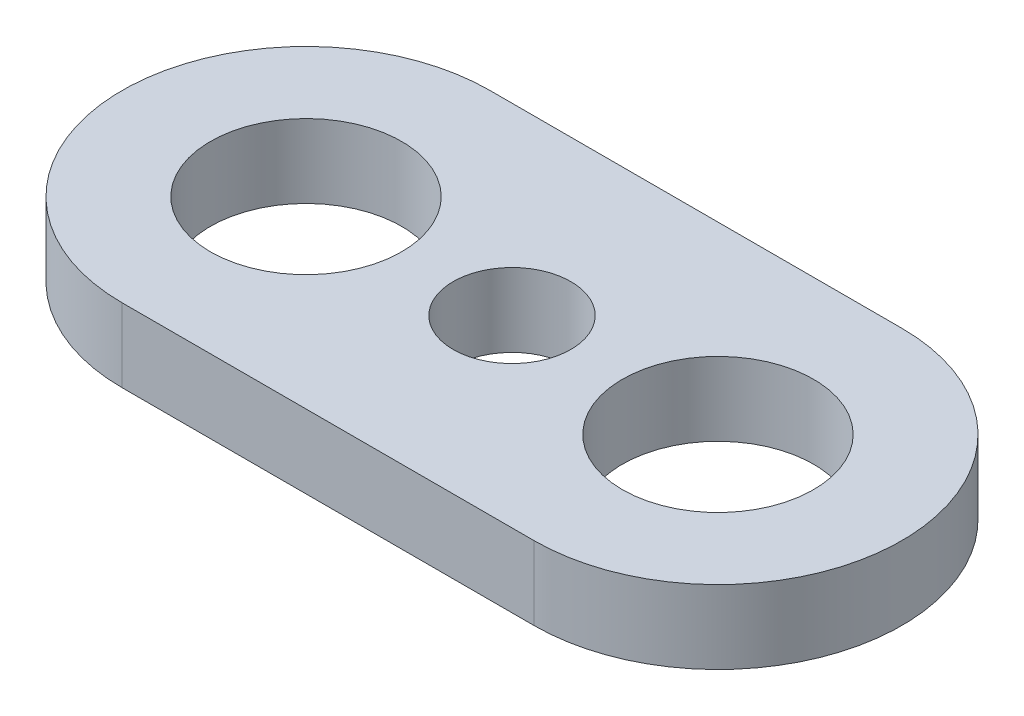
ISO-10303-21;
HEADER;
FILE_DESCRIPTION(('STEP AP214'),'2;1');
FILE_NAME('part.step','',(''),(''),'','','');
FILE_SCHEMA(('AUTOMOTIVE_DESIGN { 1 0 10303 214 1 1 1 1 }'));
ENDSEC;
DATA;
#1=APPLICATION_CONTEXT('core data for automotive mechanical design processes');
#2=APPLICATION_PROTOCOL_DEFINITION('international standard','automotive_design',2000,#1);
#3=PRODUCT_CONTEXT('',#1,'mechanical');
#4=PRODUCT('Part','Part','',(#3));
#5=PRODUCT_RELATED_PRODUCT_CATEGORY('part','',(#4));
#6=PRODUCT_DEFINITION_FORMATION('','',#4);
#7=PRODUCT_DEFINITION_CONTEXT('part definition',#1,'design');
#8=PRODUCT_DEFINITION('design','',#6,#7);
#9=PRODUCT_DEFINITION_SHAPE('','',#8);
#10=(LENGTH_UNIT() NAMED_UNIT(*) SI_UNIT(.MILLI.,.METRE.));
#11=(NAMED_UNIT(*) PLANE_ANGLE_UNIT() SI_UNIT($,.RADIAN.));
#12=(NAMED_UNIT(*) SI_UNIT($,.STERADIAN.) SOLID_ANGLE_UNIT());
#13=UNCERTAINTY_MEASURE_WITH_UNIT(LENGTH_MEASURE(1.E-05),#10,'distance_accuracy_value','');
#14=(GEOMETRIC_REPRESENTATION_CONTEXT(3) GLOBAL_UNCERTAINTY_ASSIGNED_CONTEXT((#13)) GLOBAL_UNIT_ASSIGNED_CONTEXT((#10,
#11,#12)) REPRESENTATION_CONTEXT('',''));
#15=CARTESIAN_POINT('',(0.,0.,0.));
#16=DIRECTION('',(0.,0.,1.));
#17=DIRECTION('',(1.,0.,0.));
#18=AXIS2_PLACEMENT_3D('',#15,#16,#17);
#19=CARTESIAN_POINT('',(-5.6,2.,0.));
#20=DIRECTION('',(0.,1.,0.));
#21=DIRECTION('',(0.,0.,1.));
#22=AXIS2_PLACEMENT_3D('',#19,#20,#21);
#23=PLANE('',#22);
#24=CARTESIAN_POINT('',(5.6,2.,0.));
#25=DIRECTION('',(0.,1.,0.));
#26=DIRECTION('',(0.,0.,1.));
#27=AXIS2_PLACEMENT_3D('',#24,#25,#26);
#28=CIRCLE('',#27,2.6);
#29=CARTESIAN_POINT('',(5.6,2.,2.6));
#30=VERTEX_POINT('',#29);
#31=EDGE_CURVE('E117',#30,#30,#28,.T.);
#32=ORIENTED_EDGE('',*,*,#31,.F.);
#33=EDGE_LOOP('',(#32));
#34=FACE_BOUND('',#33,.T.);
#35=CARTESIAN_POINT('',(-5.6,2.,0.));
#36=DIRECTION('',(0.,1.,0.));
#37=DIRECTION('',(0.,0.,1.));
#38=AXIS2_PLACEMENT_3D('',#35,#36,#37);
#39=CIRCLE('',#38,5.);
#40=CARTESIAN_POINT('',(-5.6,2.,-5.));
#41=VERTEX_POINT('',#40);
#42=CARTESIAN_POINT('',(-5.6,2.,5.));
#43=VERTEX_POINT('',#42);
#44=EDGE_CURVE('E87',#41,#43,#39,.T.);
#45=ORIENTED_EDGE('',*,*,#44,.T.);
#46=DIRECTION('',(1.,0.,0.));
#47=VECTOR('',#46,1.);
#48=CARTESIAN_POINT('',(-5.6,2.,5.));
#49=LINE('',#48,#47);
#50=CARTESIAN_POINT('',(5.6,2.,5.));
#51=VERTEX_POINT('',#50);
#52=EDGE_CURVE('E82',#43,#51,#49,.T.);
#53=ORIENTED_EDGE('',*,*,#52,.T.);
#54=CARTESIAN_POINT('',(5.6,2.,0.));
#55=DIRECTION('',(0.,1.,0.));
#56=DIRECTION('',(0.,0.,1.));
#57=AXIS2_PLACEMENT_3D('',#54,#55,#56);
#58=CIRCLE('',#57,5.);
#59=CARTESIAN_POINT('',(5.6,2.,-5.));
#60=VERTEX_POINT('',#59);
#61=EDGE_CURVE('E85',#51,#60,#58,.T.);
#62=ORIENTED_EDGE('',*,*,#61,.T.);
#63=DIRECTION('',(-1.,0.,0.));
#64=VECTOR('',#63,1.);
#65=CARTESIAN_POINT('',(-5.6,2.,-5.));
#66=LINE('',#65,#64);
#67=EDGE_CURVE('E52',#60,#41,#66,.T.);
#68=ORIENTED_EDGE('',*,*,#67,.T.);
#69=EDGE_LOOP('',(#45,#53,#62,#68));
#70=FACE_BOUND('',#69,.T.);
#71=CARTESIAN_POINT('',(-5.6,2.,0.));
#72=DIRECTION('',(0.,1.,0.));
#73=DIRECTION('',(0.,0.,1.));
#74=AXIS2_PLACEMENT_3D('',#71,#72,#73);
#75=CIRCLE('',#74,2.6);
#76=CARTESIAN_POINT('',(-5.6,2.,2.6));
#77=VERTEX_POINT('',#76);
#78=EDGE_CURVE('E102',#77,#77,#75,.T.);
#79=ORIENTED_EDGE('',*,*,#78,.F.);
#80=EDGE_LOOP('',(#79));
#81=FACE_BOUND('',#80,.T.);
#82=CARTESIAN_POINT('',(0.,2.,0.));
#83=DIRECTION('',(0.,1.,0.));
#84=DIRECTION('',(0.,0.,1.));
#85=AXIS2_PLACEMENT_3D('',#82,#83,#84);
#86=CIRCLE('',#85,1.6);
#87=CARTESIAN_POINT('',(0.,2.,1.6));
#88=VERTEX_POINT('',#87);
#89=EDGE_CURVE('E123',#88,#88,#86,.T.);
#90=ORIENTED_EDGE('',*,*,#89,.F.);
#91=EDGE_LOOP('',(#90));
#92=FACE_BOUND('',#91,.T.);
#93=ADVANCED_FACE('F35',(#34,#70,#81,#92),#23,.T.);
#94=CARTESIAN_POINT('',(-5.6,0.,0.));
#95=DIRECTION('',(0.,1.,0.));
#96=DIRECTION('',(0.,0.,1.));
#97=AXIS2_PLACEMENT_3D('',#94,#95,#96);
#98=PLANE('',#97);
#99=CARTESIAN_POINT('',(-5.6,0.,0.));
#100=DIRECTION('',(0.,1.,0.));
#101=DIRECTION('',(0.,0.,1.));
#102=AXIS2_PLACEMENT_3D('',#99,#100,#101);
#103=CIRCLE('',#102,5.);
#104=CARTESIAN_POINT('',(-5.6,0.,-5.));
#105=VERTEX_POINT('',#104);
#106=CARTESIAN_POINT('',(-5.6,0.,5.));
#107=VERTEX_POINT('',#106);
#108=EDGE_CURVE('E99',#105,#107,#103,.T.);
#109=ORIENTED_EDGE('',*,*,#108,.F.);
#110=DIRECTION('',(-1.,0.,0.));
#111=VECTOR('',#110,1.);
#112=CARTESIAN_POINT('',(-5.6,0.,-5.));
#113=LINE('',#112,#111);
#114=CARTESIAN_POINT('',(5.6,0.,-5.));
#115=VERTEX_POINT('',#114);
#116=EDGE_CURVE('E75',#115,#105,#113,.T.);
#117=ORIENTED_EDGE('',*,*,#116,.F.);
#118=CARTESIAN_POINT('',(5.6,0.,0.));
#119=DIRECTION('',(0.,1.,0.));
#120=DIRECTION('',(0.,0.,1.));
#121=AXIS2_PLACEMENT_3D('',#118,#119,#120);
#122=CIRCLE('',#121,5.);
#123=CARTESIAN_POINT('',(5.6,0.,5.));
#124=VERTEX_POINT('',#123);
#125=EDGE_CURVE('E69',#124,#115,#122,.T.);
#126=ORIENTED_EDGE('',*,*,#125,.F.);
#127=DIRECTION('',(1.,0.,0.));
#128=VECTOR('',#127,1.);
#129=CARTESIAN_POINT('',(-5.6,0.,5.));
#130=LINE('',#129,#128);
#131=EDGE_CURVE('E91',#107,#124,#130,.T.);
#132=ORIENTED_EDGE('',*,*,#131,.F.);
#133=EDGE_LOOP('',(#109,#117,#126,#132));
#134=FACE_BOUND('',#133,.T.);
#135=CARTESIAN_POINT('',(-5.6,0.,0.));
#136=DIRECTION('',(0.,1.,0.));
#137=DIRECTION('',(0.,0.,1.));
#138=AXIS2_PLACEMENT_3D('',#135,#136,#137);
#139=CIRCLE('',#138,2.6);
#140=CARTESIAN_POINT('',(-5.6,0.,2.6));
#141=VERTEX_POINT('',#140);
#142=EDGE_CURVE('E114',#141,#141,#139,.T.);
#143=ORIENTED_EDGE('',*,*,#142,.T.);
#144=EDGE_LOOP('',(#143));
#145=FACE_BOUND('',#144,.T.);
#146=CARTESIAN_POINT('',(5.6,0.,0.));
#147=DIRECTION('',(0.,1.,0.));
#148=DIRECTION('',(0.,0.,1.));
#149=AXIS2_PLACEMENT_3D('',#146,#147,#148);
#150=CIRCLE('',#149,2.6);
#151=CARTESIAN_POINT('',(5.6,0.,2.6));
#152=VERTEX_POINT('',#151);
#153=EDGE_CURVE('E120',#152,#152,#150,.T.);
#154=ORIENTED_EDGE('',*,*,#153,.T.);
#155=EDGE_LOOP('',(#154));
#156=FACE_BOUND('',#155,.T.);
#157=CARTESIAN_POINT('',(0.,0.,0.));
#158=DIRECTION('',(0.,1.,0.));
#159=DIRECTION('',(0.,0.,1.));
#160=AXIS2_PLACEMENT_3D('',#157,#158,#159);
#161=CIRCLE('',#160,1.6);
#162=CARTESIAN_POINT('',(0.,0.,1.6));
#163=VERTEX_POINT('',#162);
#164=EDGE_CURVE('E126',#163,#163,#161,.T.);
#165=ORIENTED_EDGE('',*,*,#164,.T.);
#166=EDGE_LOOP('',(#165));
#167=FACE_BOUND('',#166,.T.);
#168=ADVANCED_FACE('F110',(#134,#145,#156,#167),#98,.F.);
#169=CARTESIAN_POINT('',(-5.6,2.,0.));
#170=DIRECTION('',(0.,-1.,0.));
#171=DIRECTION('',(0.,0.,-1.));
#172=AXIS2_PLACEMENT_3D('',#169,#170,#171);
#173=CYLINDRICAL_SURFACE('',#172,5.);
#174=ORIENTED_EDGE('',*,*,#108,.T.);
#175=DIRECTION('',(0.,-1.,0.));
#176=VECTOR('',#175,1.);
#177=CARTESIAN_POINT('',(-5.6,2.,5.));
#178=LINE('',#177,#176);
#179=EDGE_CURVE('E11',#43,#107,#178,.T.);
#180=ORIENTED_EDGE('',*,*,#179,.F.);
#181=ORIENTED_EDGE('',*,*,#44,.F.);
#182=DIRECTION('',(0.,-1.,0.));
#183=VECTOR('',#182,1.);
#184=CARTESIAN_POINT('',(-5.6,2.,-5.));
#185=LINE('',#184,#183);
#186=EDGE_CURVE('E95',#41,#105,#185,.T.);
#187=ORIENTED_EDGE('',*,*,#186,.T.);
#188=EDGE_LOOP('',(#174,#180,#181,#187));
#189=FACE_BOUND('',#188,.T.);
#190=ADVANCED_FACE('F37',(#189),#173,.T.);
#191=CARTESIAN_POINT('',(-5.6,2.,5.));
#192=DIRECTION('',(0.,0.,-1.));
#193=DIRECTION('',(-1.,0.,0.));
#194=AXIS2_PLACEMENT_3D('',#191,#192,#193);
#195=PLANE('',#194);
#196=ORIENTED_EDGE('',*,*,#131,.T.);
#197=DIRECTION('',(0.,-1.,0.));
#198=VECTOR('',#197,1.);
#199=CARTESIAN_POINT('',(5.6,2.,5.));
#200=LINE('',#199,#198);
#201=EDGE_CURVE('E44',#51,#124,#200,.T.);
#202=ORIENTED_EDGE('',*,*,#201,.F.);
#203=ORIENTED_EDGE('',*,*,#52,.F.);
#204=ORIENTED_EDGE('',*,*,#179,.T.);
#205=EDGE_LOOP('',(#196,#202,#203,#204));
#206=FACE_BOUND('',#205,.T.);
#207=ADVANCED_FACE('F90',(#206),#195,.F.);
#208=CARTESIAN_POINT('',(5.6,2.,0.));
#209=DIRECTION('',(0.,-1.,0.));
#210=DIRECTION('',(0.,0.,-1.));
#211=AXIS2_PLACEMENT_3D('',#208,#209,#210);
#212=CYLINDRICAL_SURFACE('',#211,5.);
#213=ORIENTED_EDGE('',*,*,#125,.T.);
#214=DIRECTION('',(0.,-1.,0.));
#215=VECTOR('',#214,1.);
#216=CARTESIAN_POINT('',(5.6,2.,-5.));
#217=LINE('',#216,#215);
#218=EDGE_CURVE('E92',#60,#115,#217,.T.);
#219=ORIENTED_EDGE('',*,*,#218,.F.);
#220=ORIENTED_EDGE('',*,*,#61,.F.);
#221=ORIENTED_EDGE('',*,*,#201,.T.);
#222=EDGE_LOOP('',(#213,#219,#220,#221));
#223=FACE_BOUND('',#222,.T.);
#224=ADVANCED_FACE('F93',(#223),#212,.T.);
#225=CARTESIAN_POINT('',(-5.6,2.,-5.));
#226=DIRECTION('',(0.,0.,1.));
#227=DIRECTION('',(1.,0.,0.));
#228=AXIS2_PLACEMENT_3D('',#225,#226,#227);
#229=PLANE('',#228);
#230=ORIENTED_EDGE('',*,*,#116,.T.);
#231=ORIENTED_EDGE('',*,*,#186,.F.);
#232=ORIENTED_EDGE('',*,*,#67,.F.);
#233=ORIENTED_EDGE('',*,*,#218,.T.);
#234=EDGE_LOOP('',(#230,#231,#232,#233));
#235=FACE_BOUND('',#234,.T.);
#236=ADVANCED_FACE('F107',(#235),#229,.F.);
#237=CARTESIAN_POINT('',(-5.6,2.,0.));
#238=DIRECTION('',(0.,-1.,0.));
#239=DIRECTION('',(0.,0.,-1.));
#240=AXIS2_PLACEMENT_3D('',#237,#238,#239);
#241=CYLINDRICAL_SURFACE('',#240,2.6);
#242=ORIENTED_EDGE('',*,*,#78,.T.);
#243=EDGE_LOOP('',(#242));
#244=FACE_BOUND('',#243,.T.);
#245=ORIENTED_EDGE('',*,*,#142,.F.);
#246=EDGE_LOOP('',(#245));
#247=FACE_BOUND('',#246,.T.);
#248=ADVANCED_FACE('F144',(#244,#247),#241,.F.);
#249=CARTESIAN_POINT('',(5.6,2.,0.));
#250=DIRECTION('',(0.,-1.,0.));
#251=DIRECTION('',(0.,0.,-1.));
#252=AXIS2_PLACEMENT_3D('',#249,#250,#251);
#253=CYLINDRICAL_SURFACE('',#252,2.6);
#254=ORIENTED_EDGE('',*,*,#31,.T.);
#255=EDGE_LOOP('',(#254));
#256=FACE_BOUND('',#255,.T.);
#257=ORIENTED_EDGE('',*,*,#153,.F.);
#258=EDGE_LOOP('',(#257));
#259=FACE_BOUND('',#258,.T.);
#260=ADVANCED_FACE('F190',(#256,#259),#253,.F.);
#261=CARTESIAN_POINT('',(0.,2.,0.));
#262=DIRECTION('',(0.,-1.,0.));
#263=DIRECTION('',(0.,0.,-1.));
#264=AXIS2_PLACEMENT_3D('',#261,#262,#263);
#265=CYLINDRICAL_SURFACE('',#264,1.6);
#266=ORIENTED_EDGE('',*,*,#89,.T.);
#267=EDGE_LOOP('',(#266));
#268=FACE_BOUND('',#267,.T.);
#269=ORIENTED_EDGE('',*,*,#164,.F.);
#270=EDGE_LOOP('',(#269));
#271=FACE_BOUND('',#270,.T.);
#272=ADVANCED_FACE('F132',(#268,#271),#265,.F.);
#273=CLOSED_SHELL('',(#93,#168,#190,#207,#224,#236,#248,#260,#272));
#274=MANIFOLD_SOLID_BREP('B2',#273);
#275=ADVANCED_BREP_SHAPE_REPRESENTATION('',(#18,#274),#14);
#276=SHAPE_DEFINITION_REPRESENTATION(#9,#275);
ENDSEC;
END-ISO-10303-21;
